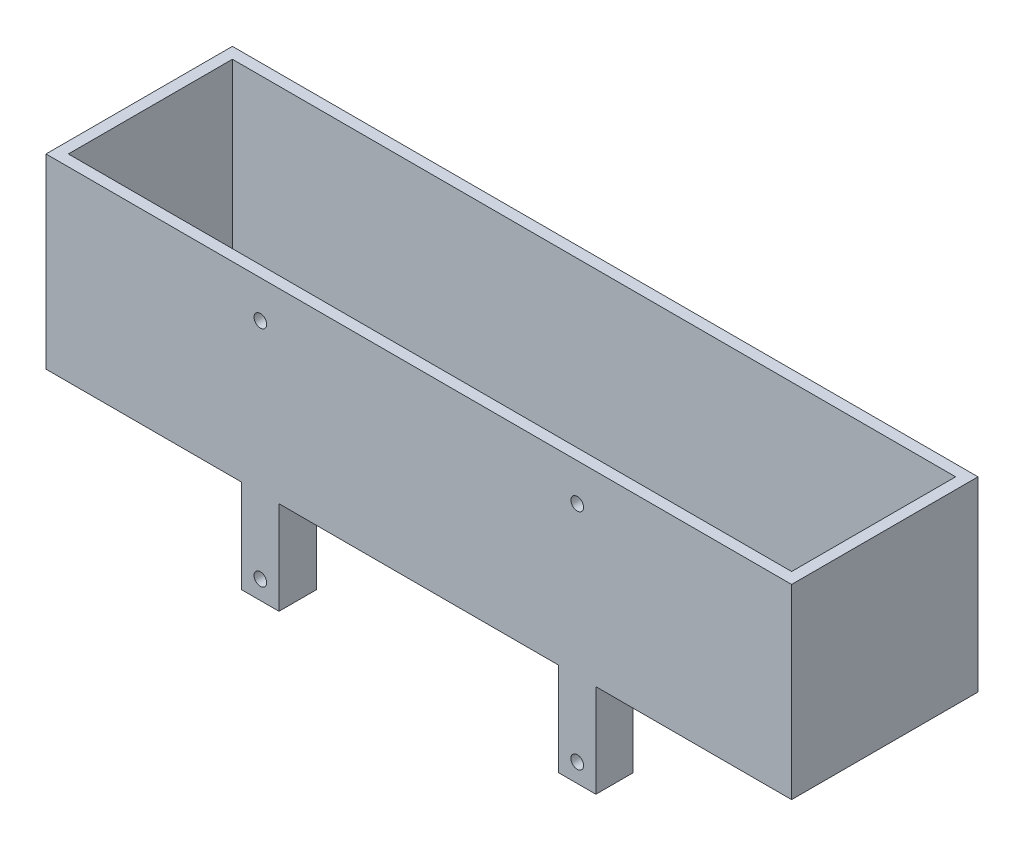
ISO-10303-21;
HEADER;
FILE_DESCRIPTION(('STEP AP214'),'2;1');
FILE_NAME('part.step','',(''),(''),'','','');
FILE_SCHEMA(('AUTOMOTIVE_DESIGN { 1 0 10303 214 1 1 1 1 }'));
ENDSEC;
DATA;
#1=APPLICATION_CONTEXT('core data for automotive mechanical design processes');
#2=APPLICATION_PROTOCOL_DEFINITION('international standard','automotive_design',2000,#1);
#3=PRODUCT_CONTEXT('',#1,'mechanical');
#4=PRODUCT('Part','Part','',(#3));
#5=PRODUCT_RELATED_PRODUCT_CATEGORY('part','',(#4));
#6=PRODUCT_DEFINITION_FORMATION('','',#4);
#7=PRODUCT_DEFINITION_CONTEXT('part definition',#1,'design');
#8=PRODUCT_DEFINITION('design','',#6,#7);
#9=PRODUCT_DEFINITION_SHAPE('','',#8);
#10=(LENGTH_UNIT() NAMED_UNIT(*) SI_UNIT(.MILLI.,.METRE.));
#11=(NAMED_UNIT(*) PLANE_ANGLE_UNIT() SI_UNIT($,.RADIAN.));
#12=(NAMED_UNIT(*) SI_UNIT($,.STERADIAN.) SOLID_ANGLE_UNIT());
#13=UNCERTAINTY_MEASURE_WITH_UNIT(LENGTH_MEASURE(1.E-05),#10,'distance_accuracy_value','');
#14=(GEOMETRIC_REPRESENTATION_CONTEXT(3) GLOBAL_UNCERTAINTY_ASSIGNED_CONTEXT((#13)) GLOBAL_UNIT_ASSIGNED_CONTEXT((#10,
#11,#12)) REPRESENTATION_CONTEXT('',''));
#15=CARTESIAN_POINT('',(0.,0.,0.));
#16=DIRECTION('',(0.,0.,1.));
#17=DIRECTION('',(1.,0.,0.));
#18=AXIS2_PLACEMENT_3D('',#15,#16,#17);
#19=CARTESIAN_POINT('',(-100.,0.,50.));
#20=DIRECTION('',(0.,1.,0.));
#21=DIRECTION('',(0.,0.,1.));
#22=AXIS2_PLACEMENT_3D('',#19,#20,#21);
#23=PLANE('',#22);
#24=CARTESIAN_POINT('',(-70.,0.,35.));
#25=DIRECTION('',(0.,-1.,0.));
#26=DIRECTION('',(0.,0.,-1.));
#27=AXIS2_PLACEMENT_3D('',#24,#25,#26);
#28=CIRCLE('',#27,1.69999999999999);
#29=CARTESIAN_POINT('',(-70.,0.,33.3));
#30=VERTEX_POINT('',#29);
#31=EDGE_CURVE('E439',#30,#30,#28,.T.);
#32=ORIENTED_EDGE('',*,*,#31,.F.);
#33=EDGE_LOOP('',(#32));
#34=FACE_BOUND('',#33,.T.);
#35=CARTESIAN_POINT('',(70.,0.,15.));
#36=DIRECTION('',(0.,-1.,0.));
#37=DIRECTION('',(0.,0.,-1.));
#38=AXIS2_PLACEMENT_3D('',#35,#36,#37);
#39=CIRCLE('',#38,1.69999999999999);
#40=CARTESIAN_POINT('',(70.,0.,13.3));
#41=VERTEX_POINT('',#40);
#42=EDGE_CURVE('E449',#41,#41,#39,.T.);
#43=ORIENTED_EDGE('',*,*,#42,.F.);
#44=EDGE_LOOP('',(#43));
#45=FACE_BOUND('',#44,.T.);
#46=CARTESIAN_POINT('',(70.,0.,35.));
#47=DIRECTION('',(0.,-1.,0.));
#48=DIRECTION('',(0.,0.,-1.));
#49=AXIS2_PLACEMENT_3D('',#46,#47,#48);
#50=CIRCLE('',#49,1.69999999999999);
#51=CARTESIAN_POINT('',(70.,0.,33.3));
#52=VERTEX_POINT('',#51);
#53=EDGE_CURVE('E432',#52,#52,#50,.T.);
#54=ORIENTED_EDGE('',*,*,#53,.F.);
#55=EDGE_LOOP('',(#54));
#56=FACE_BOUND('',#55,.T.);
#57=CARTESIAN_POINT('',(-70.,0.,15.));
#58=DIRECTION('',(0.,-1.,0.));
#59=DIRECTION('',(0.,0.,-1.));
#60=AXIS2_PLACEMENT_3D('',#57,#58,#59);
#61=CIRCLE('',#60,1.69999999999999);
#62=CARTESIAN_POINT('',(-70.,0.,13.3));
#63=VERTEX_POINT('',#62);
#64=EDGE_CURVE('E444',#63,#63,#61,.T.);
#65=ORIENTED_EDGE('',*,*,#64,.F.);
#66=EDGE_LOOP('',(#65));
#67=FACE_BOUND('',#66,.T.);
#68=DIRECTION('',(0.,0.,-1.));
#69=VECTOR('',#68,1.);
#70=CARTESIAN_POINT('',(-47.5,0.,40.));
#71=LINE('',#70,#69);
#72=CARTESIAN_POINT('',(-47.5,0.,50.));
#73=VERTEX_POINT('',#72);
#74=CARTESIAN_POINT('',(-47.5,0.,40.));
#75=VERTEX_POINT('',#74);
#76=EDGE_CURVE('E179',#73,#75,#71,.T.);
#77=ORIENTED_EDGE('',*,*,#76,.F.);
#78=DIRECTION('',(1.,0.,0.));
#79=VECTOR('',#78,1.);
#80=CARTESIAN_POINT('',(-100.,0.,50.));
#81=LINE('',#80,#79);
#82=CARTESIAN_POINT('',(-100.,0.,50.));
#83=VERTEX_POINT('',#82);
#84=EDGE_CURVE('E246',#83,#73,#81,.T.);
#85=ORIENTED_EDGE('',*,*,#84,.F.);
#86=DIRECTION('',(0.,0.,-1.));
#87=VECTOR('',#86,1.);
#88=CARTESIAN_POINT('',(-100.,0.,50.));
#89=LINE('',#88,#87);
#90=CARTESIAN_POINT('',(-100.,0.,0.));
#91=VERTEX_POINT('',#90);
#92=EDGE_CURVE('E11',#83,#91,#89,.T.);
#93=ORIENTED_EDGE('',*,*,#92,.T.);
#94=DIRECTION('',(1.,0.,0.));
#95=VECTOR('',#94,1.);
#96=CARTESIAN_POINT('',(-100.,0.,0.));
#97=LINE('',#96,#95);
#98=CARTESIAN_POINT('',(100.,0.,0.));
#99=VERTEX_POINT('',#98);
#100=EDGE_CURVE('E257',#91,#99,#97,.T.);
#101=ORIENTED_EDGE('',*,*,#100,.T.);
#102=DIRECTION('',(0.,0.,-1.));
#103=VECTOR('',#102,1.);
#104=CARTESIAN_POINT('',(100.,0.,50.));
#105=LINE('',#104,#103);
#106=CARTESIAN_POINT('',(100.,0.,50.));
#107=VERTEX_POINT('',#106);
#108=EDGE_CURVE('E51',#107,#99,#105,.T.);
#109=ORIENTED_EDGE('',*,*,#108,.F.);
#110=CARTESIAN_POINT('',(47.5,0.,50.));
#111=VERTEX_POINT('',#110);
#112=EDGE_CURVE('E249',#111,#107,#81,.T.);
#113=ORIENTED_EDGE('',*,*,#112,.F.);
#114=DIRECTION('',(0.,0.,1.));
#115=VECTOR('',#114,1.);
#116=CARTESIAN_POINT('',(47.5,0.,40.));
#117=LINE('',#116,#115);
#118=CARTESIAN_POINT('',(47.5,0.,40.));
#119=VERTEX_POINT('',#118);
#120=EDGE_CURVE('E200',#119,#111,#117,.T.);
#121=ORIENTED_EDGE('',*,*,#120,.F.);
#122=DIRECTION('',(1.,0.,0.));
#123=VECTOR('',#122,1.);
#124=CARTESIAN_POINT('',(37.5,0.,40.));
#125=LINE('',#124,#123);
#126=CARTESIAN_POINT('',(37.5,0.,40.));
#127=VERTEX_POINT('',#126);
#128=EDGE_CURVE('E63',#127,#119,#125,.T.);
#129=ORIENTED_EDGE('',*,*,#128,.F.);
#130=DIRECTION('',(0.,0.,-1.));
#131=VECTOR('',#130,1.);
#132=CARTESIAN_POINT('',(37.5,0.,40.));
#133=LINE('',#132,#131);
#134=CARTESIAN_POINT('',(37.5,0.,50.));
#135=VERTEX_POINT('',#134);
#136=EDGE_CURVE('E204',#135,#127,#133,.T.);
#137=ORIENTED_EDGE('',*,*,#136,.F.);
#138=CARTESIAN_POINT('',(-37.5,0.,50.));
#139=VERTEX_POINT('',#138);
#140=EDGE_CURVE('E251',#139,#135,#81,.T.);
#141=ORIENTED_EDGE('',*,*,#140,.F.);
#142=DIRECTION('',(0.,0.,1.));
#143=VECTOR('',#142,1.);
#144=CARTESIAN_POINT('',(-37.5,0.,40.));
#145=LINE('',#144,#143);
#146=CARTESIAN_POINT('',(-37.5,0.,40.));
#147=VERTEX_POINT('',#146);
#148=EDGE_CURVE('E171',#147,#139,#145,.T.);
#149=ORIENTED_EDGE('',*,*,#148,.F.);
#150=DIRECTION('',(1.,0.,0.));
#151=VECTOR('',#150,1.);
#152=CARTESIAN_POINT('',(-47.5,0.,40.));
#153=LINE('',#152,#151);
#154=EDGE_CURVE('E59',#75,#147,#153,.T.);
#155=ORIENTED_EDGE('',*,*,#154,.F.);
#156=EDGE_LOOP('',(#77,#85,#93,#101,#109,#113,#121,#129,#137,#141,#149,#155));
#157=FACE_BOUND('',#156,.T.);
#158=ADVANCED_FACE('F43',(#34,#45,#56,#67,#157),#23,.F.);
#159=CARTESIAN_POINT('',(-100.,0.,50.));
#160=DIRECTION('',(1.,0.,0.));
#161=DIRECTION('',(0.,0.,-1.));
#162=AXIS2_PLACEMENT_3D('',#159,#160,#161);
#163=PLANE('',#162);
#164=DIRECTION('',(0.,-1.,0.));
#165=VECTOR('',#164,1.);
#166=CARTESIAN_POINT('',(-100.,0.,0.));
#167=LINE('',#166,#165);
#168=CARTESIAN_POINT('',(-100.,50.,0.));
#169=VERTEX_POINT('',#168);
#170=EDGE_CURVE('E240',#169,#91,#167,.T.);
#171=ORIENTED_EDGE('',*,*,#170,.T.);
#172=ORIENTED_EDGE('',*,*,#92,.F.);
#173=DIRECTION('',(0.,-1.,0.));
#174=VECTOR('',#173,1.);
#175=CARTESIAN_POINT('',(-100.,0.,50.));
#176=LINE('',#175,#174);
#177=CARTESIAN_POINT('',(-100.,50.,50.));
#178=VERTEX_POINT('',#177);
#179=EDGE_CURVE('E241',#178,#83,#176,.T.);
#180=ORIENTED_EDGE('',*,*,#179,.F.);
#181=DIRECTION('',(0.,0.,-1.));
#182=VECTOR('',#181,1.);
#183=CARTESIAN_POINT('',(-100.,50.,50.));
#184=LINE('',#183,#182);
#185=EDGE_CURVE('E260',#178,#169,#184,.T.);
#186=ORIENTED_EDGE('',*,*,#185,.T.);
#187=EDGE_LOOP('',(#171,#172,#180,#186));
#188=FACE_BOUND('',#187,.T.);
#189=ADVANCED_FACE('F44',(#188),#163,.F.);
#190=CARTESIAN_POINT('',(100.,0.,50.));
#191=DIRECTION('',(-1.,0.,0.));
#192=DIRECTION('',(0.,0.,1.));
#193=AXIS2_PLACEMENT_3D('',#190,#191,#192);
#194=PLANE('',#193);
#195=DIRECTION('',(0.,1.,0.));
#196=VECTOR('',#195,1.);
#197=CARTESIAN_POINT('',(100.,0.,0.));
#198=LINE('',#197,#196);
#199=CARTESIAN_POINT('',(100.,50.,0.));
#200=VERTEX_POINT('',#199);
#201=EDGE_CURVE('E265',#99,#200,#198,.T.);
#202=ORIENTED_EDGE('',*,*,#201,.T.);
#203=DIRECTION('',(0.,0.,-1.));
#204=VECTOR('',#203,1.);
#205=CARTESIAN_POINT('',(100.,50.,50.));
#206=LINE('',#205,#204);
#207=CARTESIAN_POINT('',(100.,50.,50.));
#208=VERTEX_POINT('',#207);
#209=EDGE_CURVE('E270',#208,#200,#206,.T.);
#210=ORIENTED_EDGE('',*,*,#209,.F.);
#211=DIRECTION('',(0.,1.,0.));
#212=VECTOR('',#211,1.);
#213=CARTESIAN_POINT('',(100.,0.,50.));
#214=LINE('',#213,#212);
#215=EDGE_CURVE('E252',#107,#208,#214,.T.);
#216=ORIENTED_EDGE('',*,*,#215,.F.);
#217=ORIENTED_EDGE('',*,*,#108,.T.);
#218=EDGE_LOOP('',(#202,#210,#216,#217));
#219=FACE_BOUND('',#218,.T.);
#220=ADVANCED_FACE('F273',(#219),#194,.F.);
#221=CARTESIAN_POINT('',(-100.,50.,50.));
#222=DIRECTION('',(0.,-1.,0.));
#223=DIRECTION('',(0.,0.,-1.));
#224=AXIS2_PLACEMENT_3D('',#221,#222,#223);
#225=PLANE('',#224);
#226=DIRECTION('',(1.,0.,0.));
#227=VECTOR('',#226,1.);
#228=CARTESIAN_POINT('',(-97.,50.,47.));
#229=LINE('',#228,#227);
#230=CARTESIAN_POINT('',(-97.,50.,47.));
#231=VERTEX_POINT('',#230);
#232=CARTESIAN_POINT('',(97.,50.,47.));
#233=VERTEX_POINT('',#232);
#234=EDGE_CURVE('E178',#231,#233,#229,.T.);
#235=ORIENTED_EDGE('',*,*,#234,.F.);
#236=DIRECTION('',(0.,0.,1.));
#237=VECTOR('',#236,1.);
#238=CARTESIAN_POINT('',(-97.,50.,3.));
#239=LINE('',#238,#237);
#240=CARTESIAN_POINT('',(-97.,50.,3.));
#241=VERTEX_POINT('',#240);
#242=EDGE_CURVE('E180',#241,#231,#239,.T.);
#243=ORIENTED_EDGE('',*,*,#242,.F.);
#244=DIRECTION('',(-1.,0.,0.));
#245=VECTOR('',#244,1.);
#246=CARTESIAN_POINT('',(-97.,50.,3.));
#247=LINE('',#246,#245);
#248=CARTESIAN_POINT('',(97.,50.,3.));
#249=VERTEX_POINT('',#248);
#250=EDGE_CURVE('E217',#249,#241,#247,.T.);
#251=ORIENTED_EDGE('',*,*,#250,.F.);
#252=DIRECTION('',(0.,0.,-1.));
#253=VECTOR('',#252,1.);
#254=CARTESIAN_POINT('',(97.,50.,3.));
#255=LINE('',#254,#253);
#256=EDGE_CURVE('E228',#233,#249,#255,.T.);
#257=ORIENTED_EDGE('',*,*,#256,.F.);
#258=EDGE_LOOP('',(#235,#243,#251,#257));
#259=FACE_BOUND('',#258,.T.);
#260=DIRECTION('',(-1.,0.,0.));
#261=VECTOR('',#260,1.);
#262=CARTESIAN_POINT('',(-100.,50.,0.));
#263=LINE('',#262,#261);
#264=EDGE_CURVE('E250',#200,#169,#263,.T.);
#265=ORIENTED_EDGE('',*,*,#264,.T.);
#266=ORIENTED_EDGE('',*,*,#185,.F.);
#267=DIRECTION('',(-1.,0.,0.));
#268=VECTOR('',#267,1.);
#269=CARTESIAN_POINT('',(-100.,50.,50.));
#270=LINE('',#269,#268);
#271=EDGE_CURVE('E254',#208,#178,#270,.T.);
#272=ORIENTED_EDGE('',*,*,#271,.F.);
#273=ORIENTED_EDGE('',*,*,#209,.T.);
#274=EDGE_LOOP('',(#265,#266,#272,#273));
#275=FACE_BOUND('',#274,.T.);
#276=ADVANCED_FACE('F284',(#259,#275),#225,.F.);
#277=CARTESIAN_POINT('',(0.,0.,50.));
#278=DIRECTION('',(0.,0.,-1.));
#279=DIRECTION('',(-1.,0.,0.));
#280=AXIS2_PLACEMENT_3D('',#277,#278,#279);
#281=PLANE('',#280);
#282=CARTESIAN_POINT('',(-42.5,-20.,50.));
#283=DIRECTION('',(0.,0.,1.));
#284=DIRECTION('',(1.,0.,0.));
#285=AXIS2_PLACEMENT_3D('',#282,#283,#284);
#286=CIRCLE('',#285,1.7);
#287=CARTESIAN_POINT('',(-40.8,-20.,50.));
#288=VERTEX_POINT('',#287);
#289=EDGE_CURVE('E414',#288,#288,#286,.T.);
#290=ORIENTED_EDGE('',*,*,#289,.F.);
#291=EDGE_LOOP('',(#290));
#292=FACE_BOUND('',#291,.T.);
#293=CARTESIAN_POINT('',(42.5,-20.,50.));
#294=DIRECTION('',(0.,0.,1.));
#295=DIRECTION('',(1.,0.,0.));
#296=AXIS2_PLACEMENT_3D('',#293,#294,#295);
#297=CIRCLE('',#296,1.7);
#298=CARTESIAN_POINT('',(44.2,-20.,50.));
#299=VERTEX_POINT('',#298);
#300=EDGE_CURVE('E415',#299,#299,#297,.T.);
#301=ORIENTED_EDGE('',*,*,#300,.F.);
#302=EDGE_LOOP('',(#301));
#303=FACE_BOUND('',#302,.T.);
#304=CARTESIAN_POINT('',(-42.5,40.,50.));
#305=DIRECTION('',(0.,0.,1.));
#306=DIRECTION('',(1.,0.,0.));
#307=AXIS2_PLACEMENT_3D('',#304,#305,#306);
#308=CIRCLE('',#307,1.7);
#309=CARTESIAN_POINT('',(-40.8,40.,50.));
#310=VERTEX_POINT('',#309);
#311=EDGE_CURVE('E426',#310,#310,#308,.T.);
#312=ORIENTED_EDGE('',*,*,#311,.F.);
#313=EDGE_LOOP('',(#312));
#314=FACE_BOUND('',#313,.T.);
#315=CARTESIAN_POINT('',(42.5,40.,50.));
#316=DIRECTION('',(0.,0.,1.));
#317=DIRECTION('',(1.,0.,0.));
#318=AXIS2_PLACEMENT_3D('',#315,#316,#317);
#319=CIRCLE('',#318,1.7);
#320=CARTESIAN_POINT('',(44.2,40.,50.));
#321=VERTEX_POINT('',#320);
#322=EDGE_CURVE('E427',#321,#321,#319,.T.);
#323=ORIENTED_EDGE('',*,*,#322,.F.);
#324=EDGE_LOOP('',(#323));
#325=FACE_BOUND('',#324,.T.);
#326=ORIENTED_EDGE('',*,*,#179,.T.);
#327=ORIENTED_EDGE('',*,*,#84,.T.);
#328=DIRECTION('',(0.,1.,0.));
#329=VECTOR('',#328,1.);
#330=CARTESIAN_POINT('',(-47.5,-25.,50.));
#331=LINE('',#330,#329);
#332=CARTESIAN_POINT('',(-47.5,-25.,50.));
#333=VERTEX_POINT('',#332);
#334=EDGE_CURVE('E456',#333,#73,#331,.T.);
#335=ORIENTED_EDGE('',*,*,#334,.F.);
#336=DIRECTION('',(-1.,0.,0.));
#337=VECTOR('',#336,1.);
#338=CARTESIAN_POINT('',(-47.5,-25.,50.));
#339=LINE('',#338,#337);
#340=CARTESIAN_POINT('',(-37.5,-25.,50.));
#341=VERTEX_POINT('',#340);
#342=EDGE_CURVE('E168',#341,#333,#339,.T.);
#343=ORIENTED_EDGE('',*,*,#342,.F.);
#344=DIRECTION('',(0.,1.,0.));
#345=VECTOR('',#344,1.);
#346=CARTESIAN_POINT('',(-37.5,-25.,50.));
#347=LINE('',#346,#345);
#348=EDGE_CURVE('E185',#341,#139,#347,.T.);
#349=ORIENTED_EDGE('',*,*,#348,.T.);
#350=ORIENTED_EDGE('',*,*,#140,.T.);
#351=DIRECTION('',(0.,1.,0.));
#352=VECTOR('',#351,1.);
#353=CARTESIAN_POINT('',(37.5,-25.,50.));
#354=LINE('',#353,#352);
#355=CARTESIAN_POINT('',(37.5,-25.,50.));
#356=VERTEX_POINT('',#355);
#357=EDGE_CURVE('E193',#356,#135,#354,.T.);
#358=ORIENTED_EDGE('',*,*,#357,.F.);
#359=DIRECTION('',(-1.,0.,0.));
#360=VECTOR('',#359,1.);
#361=CARTESIAN_POINT('',(37.5,-25.,50.));
#362=LINE('',#361,#360);
#363=CARTESIAN_POINT('',(47.5,-25.,50.));
#364=VERTEX_POINT('',#363);
#365=EDGE_CURVE('E196',#364,#356,#362,.T.);
#366=ORIENTED_EDGE('',*,*,#365,.F.);
#367=DIRECTION('',(0.,1.,0.));
#368=VECTOR('',#367,1.);
#369=CARTESIAN_POINT('',(47.5,-25.,50.));
#370=LINE('',#369,#368);
#371=EDGE_CURVE('E194',#364,#111,#370,.T.);
#372=ORIENTED_EDGE('',*,*,#371,.T.);
#373=ORIENTED_EDGE('',*,*,#112,.T.);
#374=ORIENTED_EDGE('',*,*,#215,.T.);
#375=ORIENTED_EDGE('',*,*,#271,.T.);
#376=EDGE_LOOP('',(#326,#327,#335,#343,#349,#350,#358,#366,#372,#373,#374,#375));
#377=FACE_BOUND('',#376,.T.);
#378=ADVANCED_FACE('F290',(#292,#303,#314,#325,#377),#281,.F.);
#379=CARTESIAN_POINT('',(0.,0.,0.));
#380=DIRECTION('',(0.,0.,-1.));
#381=DIRECTION('',(-1.,0.,0.));
#382=AXIS2_PLACEMENT_3D('',#379,#380,#381);
#383=PLANE('',#382);
#384=ORIENTED_EDGE('',*,*,#170,.F.);
#385=ORIENTED_EDGE('',*,*,#264,.F.);
#386=ORIENTED_EDGE('',*,*,#201,.F.);
#387=ORIENTED_EDGE('',*,*,#100,.F.);
#388=EDGE_LOOP('',(#384,#385,#386,#387));
#389=FACE_BOUND('',#388,.T.);
#390=ADVANCED_FACE('F276',(#389),#383,.T.);
#391=CARTESIAN_POINT('',(-97.,3.,3.));
#392=DIRECTION('',(-1.,0.,0.));
#393=DIRECTION('',(0.,0.,1.));
#394=AXIS2_PLACEMENT_3D('',#391,#392,#393);
#395=PLANE('',#394);
#396=ORIENTED_EDGE('',*,*,#242,.T.);
#397=DIRECTION('',(0.,1.,0.));
#398=VECTOR('',#397,1.);
#399=CARTESIAN_POINT('',(-97.,3.,47.));
#400=LINE('',#399,#398);
#401=CARTESIAN_POINT('',(-97.,3.,47.));
#402=VERTEX_POINT('',#401);
#403=EDGE_CURVE('E227',#402,#231,#400,.T.);
#404=ORIENTED_EDGE('',*,*,#403,.F.);
#405=DIRECTION('',(0.,0.,1.));
#406=VECTOR('',#405,1.);
#407=CARTESIAN_POINT('',(-97.,3.,3.));
#408=LINE('',#407,#406);
#409=CARTESIAN_POINT('',(-97.,3.,3.));
#410=VERTEX_POINT('',#409);
#411=EDGE_CURVE('E212',#410,#402,#408,.T.);
#412=ORIENTED_EDGE('',*,*,#411,.F.);
#413=DIRECTION('',(0.,1.,0.));
#414=VECTOR('',#413,1.);
#415=CARTESIAN_POINT('',(-97.,3.,3.));
#416=LINE('',#415,#414);
#417=EDGE_CURVE('E233',#410,#241,#416,.T.);
#418=ORIENTED_EDGE('',*,*,#417,.T.);
#419=EDGE_LOOP('',(#396,#404,#412,#418));
#420=FACE_BOUND('',#419,.T.);
#421=ADVANCED_FACE('F340',(#420),#395,.F.);
#422=CARTESIAN_POINT('',(-97.,3.,3.));
#423=DIRECTION('',(0.,0.,-1.));
#424=DIRECTION('',(-1.,0.,0.));
#425=AXIS2_PLACEMENT_3D('',#422,#423,#424);
#426=PLANE('',#425);
#427=ORIENTED_EDGE('',*,*,#250,.T.);
#428=ORIENTED_EDGE('',*,*,#417,.F.);
#429=DIRECTION('',(-1.,0.,0.));
#430=VECTOR('',#429,1.);
#431=CARTESIAN_POINT('',(-97.,3.,3.));
#432=LINE('',#431,#430);
#433=CARTESIAN_POINT('',(97.,3.,3.));
#434=VERTEX_POINT('',#433);
#435=EDGE_CURVE('E221',#434,#410,#432,.T.);
#436=ORIENTED_EDGE('',*,*,#435,.F.);
#437=DIRECTION('',(0.,1.,0.));
#438=VECTOR('',#437,1.);
#439=CARTESIAN_POINT('',(97.,3.,3.));
#440=LINE('',#439,#438);
#441=EDGE_CURVE('E236',#434,#249,#440,.T.);
#442=ORIENTED_EDGE('',*,*,#441,.T.);
#443=EDGE_LOOP('',(#427,#428,#436,#442));
#444=FACE_BOUND('',#443,.T.);
#445=ADVANCED_FACE('F345',(#444),#426,.F.);
#446=CARTESIAN_POINT('',(97.,3.,3.));
#447=DIRECTION('',(1.,0.,0.));
#448=DIRECTION('',(0.,0.,-1.));
#449=AXIS2_PLACEMENT_3D('',#446,#447,#448);
#450=PLANE('',#449);
#451=ORIENTED_EDGE('',*,*,#256,.T.);
#452=ORIENTED_EDGE('',*,*,#441,.F.);
#453=DIRECTION('',(0.,0.,-1.));
#454=VECTOR('',#453,1.);
#455=CARTESIAN_POINT('',(97.,3.,3.));
#456=LINE('',#455,#454);
#457=CARTESIAN_POINT('',(97.,3.,47.));
#458=VERTEX_POINT('',#457);
#459=EDGE_CURVE('E222',#458,#434,#456,.T.);
#460=ORIENTED_EDGE('',*,*,#459,.F.);
#461=DIRECTION('',(0.,1.,0.));
#462=VECTOR('',#461,1.);
#463=CARTESIAN_POINT('',(97.,3.,47.));
#464=LINE('',#463,#462);
#465=EDGE_CURVE('E238',#458,#233,#464,.T.);
#466=ORIENTED_EDGE('',*,*,#465,.T.);
#467=EDGE_LOOP('',(#451,#452,#460,#466));
#468=FACE_BOUND('',#467,.T.);
#469=ADVANCED_FACE('F346',(#468),#450,.F.);
#470=CARTESIAN_POINT('',(-97.,3.,47.));
#471=DIRECTION('',(0.,0.,1.));
#472=DIRECTION('',(1.,0.,0.));
#473=AXIS2_PLACEMENT_3D('',#470,#471,#472);
#474=PLANE('',#473);
#475=CARTESIAN_POINT('',(-42.5,40.,47.));
#476=DIRECTION('',(0.,0.,1.));
#477=DIRECTION('',(1.,0.,0.));
#478=AXIS2_PLACEMENT_3D('',#475,#476,#477);
#479=CIRCLE('',#478,1.7);
#480=CARTESIAN_POINT('',(-40.8,40.,47.));
#481=VERTEX_POINT('',#480);
#482=EDGE_CURVE('E425',#481,#481,#479,.T.);
#483=ORIENTED_EDGE('',*,*,#482,.T.);
#484=EDGE_LOOP('',(#483));
#485=FACE_BOUND('',#484,.T.);
#486=CARTESIAN_POINT('',(42.5,40.,47.));
#487=DIRECTION('',(0.,0.,1.));
#488=DIRECTION('',(1.,0.,0.));
#489=AXIS2_PLACEMENT_3D('',#486,#487,#488);
#490=CIRCLE('',#489,1.7);
#491=CARTESIAN_POINT('',(44.2,40.,47.));
#492=VERTEX_POINT('',#491);
#493=EDGE_CURVE('E413',#492,#492,#490,.T.);
#494=ORIENTED_EDGE('',*,*,#493,.T.);
#495=EDGE_LOOP('',(#494));
#496=FACE_BOUND('',#495,.T.);
#497=ORIENTED_EDGE('',*,*,#234,.T.);
#498=ORIENTED_EDGE('',*,*,#465,.F.);
#499=DIRECTION('',(1.,0.,0.));
#500=VECTOR('',#499,1.);
#501=CARTESIAN_POINT('',(-97.,3.,47.));
#502=LINE('',#501,#500);
#503=EDGE_CURVE('E220',#402,#458,#502,.T.);
#504=ORIENTED_EDGE('',*,*,#503,.F.);
#505=ORIENTED_EDGE('',*,*,#403,.T.);
#506=EDGE_LOOP('',(#497,#498,#504,#505));
#507=FACE_BOUND('',#506,.T.);
#508=ADVANCED_FACE('F343',(#485,#496,#507),#474,.F.);
#509=CARTESIAN_POINT('',(0.,3.,0.));
#510=DIRECTION('',(0.,1.,0.));
#511=DIRECTION('',(0.,0.,1.));
#512=AXIS2_PLACEMENT_3D('',#509,#510,#511);
#513=PLANE('',#512);
#514=CARTESIAN_POINT('',(-70.,3.,35.));
#515=DIRECTION('',(0.,-1.,0.));
#516=DIRECTION('',(0.,0.,-1.));
#517=AXIS2_PLACEMENT_3D('',#514,#515,#516);
#518=CIRCLE('',#517,1.69999999999999);
#519=CARTESIAN_POINT('',(-70.,3.,33.3));
#520=VERTEX_POINT('',#519);
#521=EDGE_CURVE('E441',#520,#520,#518,.T.);
#522=ORIENTED_EDGE('',*,*,#521,.T.);
#523=EDGE_LOOP('',(#522));
#524=FACE_BOUND('',#523,.T.);
#525=CARTESIAN_POINT('',(70.,3.,15.));
#526=DIRECTION('',(0.,-1.,0.));
#527=DIRECTION('',(0.,0.,-1.));
#528=AXIS2_PLACEMENT_3D('',#525,#526,#527);
#529=CIRCLE('',#528,1.69999999999999);
#530=CARTESIAN_POINT('',(70.,3.,13.3));
#531=VERTEX_POINT('',#530);
#532=EDGE_CURVE('E440',#531,#531,#529,.T.);
#533=ORIENTED_EDGE('',*,*,#532,.T.);
#534=EDGE_LOOP('',(#533));
#535=FACE_BOUND('',#534,.T.);
#536=CARTESIAN_POINT('',(70.,3.,35.));
#537=DIRECTION('',(0.,-1.,0.));
#538=DIRECTION('',(0.,0.,-1.));
#539=AXIS2_PLACEMENT_3D('',#536,#537,#538);
#540=CIRCLE('',#539,1.69999999999999);
#541=CARTESIAN_POINT('',(70.,3.,33.3));
#542=VERTEX_POINT('',#541);
#543=EDGE_CURVE('E422',#542,#542,#540,.T.);
#544=ORIENTED_EDGE('',*,*,#543,.T.);
#545=EDGE_LOOP('',(#544));
#546=FACE_BOUND('',#545,.T.);
#547=CARTESIAN_POINT('',(-70.,3.,15.));
#548=DIRECTION('',(0.,-1.,0.));
#549=DIRECTION('',(0.,0.,-1.));
#550=AXIS2_PLACEMENT_3D('',#547,#548,#549);
#551=CIRCLE('',#550,1.69999999999999);
#552=CARTESIAN_POINT('',(-70.,3.,13.3));
#553=VERTEX_POINT('',#552);
#554=EDGE_CURVE('E186',#553,#553,#551,.T.);
#555=ORIENTED_EDGE('',*,*,#554,.T.);
#556=EDGE_LOOP('',(#555));
#557=FACE_BOUND('',#556,.T.);
#558=ORIENTED_EDGE('',*,*,#411,.T.);
#559=ORIENTED_EDGE('',*,*,#503,.T.);
#560=ORIENTED_EDGE('',*,*,#459,.T.);
#561=ORIENTED_EDGE('',*,*,#435,.T.);
#562=EDGE_LOOP('',(#558,#559,#560,#561));
#563=FACE_BOUND('',#562,.T.);
#564=ADVANCED_FACE('F318',(#524,#535,#546,#557,#563),#513,.T.);
#565=CARTESIAN_POINT('',(37.5,-25.,40.));
#566=DIRECTION('',(1.,0.,0.));
#567=DIRECTION('',(0.,0.,-1.));
#568=AXIS2_PLACEMENT_3D('',#565,#566,#567);
#569=PLANE('',#568);
#570=ORIENTED_EDGE('',*,*,#136,.T.);
#571=DIRECTION('',(0.,1.,0.));
#572=VECTOR('',#571,1.);
#573=CARTESIAN_POINT('',(37.5,-25.,40.));
#574=LINE('',#573,#572);
#575=CARTESIAN_POINT('',(37.5,-25.,40.));
#576=VERTEX_POINT('',#575);
#577=EDGE_CURVE('E187',#576,#127,#574,.T.);
#578=ORIENTED_EDGE('',*,*,#577,.F.);
#579=DIRECTION('',(0.,0.,-1.));
#580=VECTOR('',#579,1.);
#581=CARTESIAN_POINT('',(37.5,-25.,40.));
#582=LINE('',#581,#580);
#583=EDGE_CURVE('E205',#356,#576,#582,.T.);
#584=ORIENTED_EDGE('',*,*,#583,.F.);
#585=ORIENTED_EDGE('',*,*,#357,.T.);
#586=EDGE_LOOP('',(#570,#578,#584,#585));
#587=FACE_BOUND('',#586,.T.);
#588=ADVANCED_FACE('F300',(#587),#569,.F.);
#589=CARTESIAN_POINT('',(37.5,-25.,40.));
#590=DIRECTION('',(0.,0.,1.));
#591=DIRECTION('',(1.,0.,0.));
#592=AXIS2_PLACEMENT_3D('',#589,#590,#591);
#593=PLANE('',#592);
#594=CARTESIAN_POINT('',(42.5,-20.,40.));
#595=DIRECTION('',(0.,0.,1.));
#596=DIRECTION('',(1.,0.,0.));
#597=AXIS2_PLACEMENT_3D('',#594,#595,#596);
#598=CIRCLE('',#597,1.7);
#599=CARTESIAN_POINT('',(44.2,-20.,40.));
#600=VERTEX_POINT('',#599);
#601=EDGE_CURVE('E416',#600,#600,#598,.T.);
#602=ORIENTED_EDGE('',*,*,#601,.T.);
#603=EDGE_LOOP('',(#602));
#604=FACE_BOUND('',#603,.T.);
#605=ORIENTED_EDGE('',*,*,#128,.T.);
#606=DIRECTION('',(0.,1.,0.));
#607=VECTOR('',#606,1.);
#608=CARTESIAN_POINT('',(47.5,-25.,40.));
#609=LINE('',#608,#607);
#610=CARTESIAN_POINT('',(47.5,-25.,40.));
#611=VERTEX_POINT('',#610);
#612=EDGE_CURVE('E190',#611,#119,#609,.T.);
#613=ORIENTED_EDGE('',*,*,#612,.F.);
#614=DIRECTION('',(1.,0.,0.));
#615=VECTOR('',#614,1.);
#616=CARTESIAN_POINT('',(37.5,-25.,40.));
#617=LINE('',#616,#615);
#618=EDGE_CURVE('E209',#576,#611,#617,.T.);
#619=ORIENTED_EDGE('',*,*,#618,.F.);
#620=ORIENTED_EDGE('',*,*,#577,.T.);
#621=EDGE_LOOP('',(#605,#613,#619,#620));
#622=FACE_BOUND('',#621,.T.);
#623=ADVANCED_FACE('F307',(#604,#622),#593,.F.);
#624=CARTESIAN_POINT('',(47.5,-25.,40.));
#625=DIRECTION('',(-1.,0.,0.));
#626=DIRECTION('',(0.,0.,1.));
#627=AXIS2_PLACEMENT_3D('',#624,#625,#626);
#628=PLANE('',#627);
#629=ORIENTED_EDGE('',*,*,#120,.T.);
#630=ORIENTED_EDGE('',*,*,#371,.F.);
#631=DIRECTION('',(0.,0.,1.));
#632=VECTOR('',#631,1.);
#633=CARTESIAN_POINT('',(47.5,-25.,40.));
#634=LINE('',#633,#632);
#635=EDGE_CURVE('E208',#611,#364,#634,.T.);
#636=ORIENTED_EDGE('',*,*,#635,.F.);
#637=ORIENTED_EDGE('',*,*,#612,.T.);
#638=EDGE_LOOP('',(#629,#630,#636,#637));
#639=FACE_BOUND('',#638,.T.);
#640=ADVANCED_FACE('F303',(#639),#628,.F.);
#641=CARTESIAN_POINT('',(0.,-25.,0.));
#642=DIRECTION('',(0.,1.,0.));
#643=DIRECTION('',(0.,0.,1.));
#644=AXIS2_PLACEMENT_3D('',#641,#642,#643);
#645=PLANE('',#644);
#646=ORIENTED_EDGE('',*,*,#583,.T.);
#647=ORIENTED_EDGE('',*,*,#618,.T.);
#648=ORIENTED_EDGE('',*,*,#635,.T.);
#649=ORIENTED_EDGE('',*,*,#365,.T.);
#650=EDGE_LOOP('',(#646,#647,#648,#649));
#651=FACE_BOUND('',#650,.T.);
#652=ADVANCED_FACE('F302',(#651),#645,.F.);
#653=CARTESIAN_POINT('',(-47.5,-25.,40.));
#654=DIRECTION('',(1.,0.,0.));
#655=DIRECTION('',(0.,0.,-1.));
#656=AXIS2_PLACEMENT_3D('',#653,#654,#655);
#657=PLANE('',#656);
#658=ORIENTED_EDGE('',*,*,#76,.T.);
#659=DIRECTION('',(0.,1.,0.));
#660=VECTOR('',#659,1.);
#661=CARTESIAN_POINT('',(-47.5,-25.,40.));
#662=LINE('',#661,#660);
#663=CARTESIAN_POINT('',(-47.5,-25.,40.));
#664=VERTEX_POINT('',#663);
#665=EDGE_CURVE('E158',#664,#75,#662,.T.);
#666=ORIENTED_EDGE('',*,*,#665,.F.);
#667=DIRECTION('',(0.,0.,-1.));
#668=VECTOR('',#667,1.);
#669=CARTESIAN_POINT('',(-47.5,-25.,40.));
#670=LINE('',#669,#668);
#671=EDGE_CURVE('E164',#333,#664,#670,.T.);
#672=ORIENTED_EDGE('',*,*,#671,.F.);
#673=ORIENTED_EDGE('',*,*,#334,.T.);
#674=EDGE_LOOP('',(#658,#666,#672,#673));
#675=FACE_BOUND('',#674,.T.);
#676=ADVANCED_FACE('F177',(#675),#657,.F.);
#677=CARTESIAN_POINT('',(-47.5,-25.,40.));
#678=DIRECTION('',(0.,0.,1.));
#679=DIRECTION('',(1.,0.,0.));
#680=AXIS2_PLACEMENT_3D('',#677,#678,#679);
#681=PLANE('',#680);
#682=CARTESIAN_POINT('',(-42.5,-20.,40.));
#683=DIRECTION('',(0.,0.,1.));
#684=DIRECTION('',(1.,0.,0.));
#685=AXIS2_PLACEMENT_3D('',#682,#683,#684);
#686=CIRCLE('',#685,1.7);
#687=CARTESIAN_POINT('',(-40.8,-20.,40.));
#688=VERTEX_POINT('',#687);
#689=EDGE_CURVE('E406',#688,#688,#686,.T.);
#690=ORIENTED_EDGE('',*,*,#689,.T.);
#691=EDGE_LOOP('',(#690));
#692=FACE_BOUND('',#691,.T.);
#693=ORIENTED_EDGE('',*,*,#154,.T.);
#694=DIRECTION('',(0.,1.,0.));
#695=VECTOR('',#694,1.);
#696=CARTESIAN_POINT('',(-37.5,-25.,40.));
#697=LINE('',#696,#695);
#698=CARTESIAN_POINT('',(-37.5,-25.,40.));
#699=VERTEX_POINT('',#698);
#700=EDGE_CURVE('E161',#699,#147,#697,.T.);
#701=ORIENTED_EDGE('',*,*,#700,.F.);
#702=DIRECTION('',(1.,0.,0.));
#703=VECTOR('',#702,1.);
#704=CARTESIAN_POINT('',(-47.5,-25.,40.));
#705=LINE('',#704,#703);
#706=EDGE_CURVE('E152',#664,#699,#705,.T.);
#707=ORIENTED_EDGE('',*,*,#706,.F.);
#708=ORIENTED_EDGE('',*,*,#665,.T.);
#709=EDGE_LOOP('',(#693,#701,#707,#708));
#710=FACE_BOUND('',#709,.T.);
#711=ADVANCED_FACE('F156',(#692,#710),#681,.F.);
#712=CARTESIAN_POINT('',(-37.5,-25.,40.));
#713=DIRECTION('',(-1.,0.,0.));
#714=DIRECTION('',(0.,0.,1.));
#715=AXIS2_PLACEMENT_3D('',#712,#713,#714);
#716=PLANE('',#715);
#717=ORIENTED_EDGE('',*,*,#148,.T.);
#718=ORIENTED_EDGE('',*,*,#348,.F.);
#719=DIRECTION('',(0.,0.,1.));
#720=VECTOR('',#719,1.);
#721=CARTESIAN_POINT('',(-37.5,-25.,40.));
#722=LINE('',#721,#720);
#723=EDGE_CURVE('E163',#699,#341,#722,.T.);
#724=ORIENTED_EDGE('',*,*,#723,.F.);
#725=ORIENTED_EDGE('',*,*,#700,.T.);
#726=EDGE_LOOP('',(#717,#718,#724,#725));
#727=FACE_BOUND('',#726,.T.);
#728=ADVANCED_FACE('F368',(#727),#716,.F.);
#729=CARTESIAN_POINT('',(0.,-25.,0.));
#730=DIRECTION('',(0.,1.,0.));
#731=DIRECTION('',(0.,0.,1.));
#732=AXIS2_PLACEMENT_3D('',#729,#730,#731);
#733=PLANE('',#732);
#734=ORIENTED_EDGE('',*,*,#671,.T.);
#735=ORIENTED_EDGE('',*,*,#706,.T.);
#736=ORIENTED_EDGE('',*,*,#723,.T.);
#737=ORIENTED_EDGE('',*,*,#342,.T.);
#738=EDGE_LOOP('',(#734,#735,#736,#737));
#739=FACE_BOUND('',#738,.T.);
#740=ADVANCED_FACE('F169',(#739),#733,.F.);
#741=CARTESIAN_POINT('',(-70.,3.,15.));
#742=DIRECTION('',(0.,-1.,0.));
#743=DIRECTION('',(0.,0.,-1.));
#744=AXIS2_PLACEMENT_3D('',#741,#742,#743);
#745=CYLINDRICAL_SURFACE('',#744,1.69999999999999);
#746=ORIENTED_EDGE('',*,*,#554,.F.);
#747=EDGE_LOOP('',(#746));
#748=FACE_BOUND('',#747,.T.);
#749=ORIENTED_EDGE('',*,*,#64,.T.);
#750=EDGE_LOOP('',(#749));
#751=FACE_BOUND('',#750,.T.);
#752=ADVANCED_FACE('F373',(#748,#751),#745,.F.);
#753=CARTESIAN_POINT('',(70.,3.,35.));
#754=DIRECTION('',(0.,-1.,0.));
#755=DIRECTION('',(0.,0.,-1.));
#756=AXIS2_PLACEMENT_3D('',#753,#754,#755);
#757=CYLINDRICAL_SURFACE('',#756,1.69999999999999);
#758=ORIENTED_EDGE('',*,*,#543,.F.);
#759=EDGE_LOOP('',(#758));
#760=FACE_BOUND('',#759,.T.);
#761=ORIENTED_EDGE('',*,*,#53,.T.);
#762=EDGE_LOOP('',(#761));
#763=FACE_BOUND('',#762,.T.);
#764=ADVANCED_FACE('F376',(#760,#763),#757,.F.);
#765=CARTESIAN_POINT('',(70.,3.,15.));
#766=DIRECTION('',(0.,-1.,0.));
#767=DIRECTION('',(0.,0.,-1.));
#768=AXIS2_PLACEMENT_3D('',#765,#766,#767);
#769=CYLINDRICAL_SURFACE('',#768,1.69999999999999);
#770=ORIENTED_EDGE('',*,*,#532,.F.);
#771=EDGE_LOOP('',(#770));
#772=FACE_BOUND('',#771,.T.);
#773=ORIENTED_EDGE('',*,*,#42,.T.);
#774=EDGE_LOOP('',(#773));
#775=FACE_BOUND('',#774,.T.);
#776=ADVANCED_FACE('F378',(#772,#775),#769,.F.);
#777=CARTESIAN_POINT('',(-70.,3.,35.));
#778=DIRECTION('',(0.,-1.,0.));
#779=DIRECTION('',(0.,0.,-1.));
#780=AXIS2_PLACEMENT_3D('',#777,#778,#779);
#781=CYLINDRICAL_SURFACE('',#780,1.69999999999999);
#782=ORIENTED_EDGE('',*,*,#521,.F.);
#783=EDGE_LOOP('',(#782));
#784=FACE_BOUND('',#783,.T.);
#785=ORIENTED_EDGE('',*,*,#31,.T.);
#786=EDGE_LOOP('',(#785));
#787=FACE_BOUND('',#786,.T.);
#788=ADVANCED_FACE('F381',(#784,#787),#781,.F.);
#789=CARTESIAN_POINT('',(42.5,40.,47.));
#790=DIRECTION('',(0.,0.,1.));
#791=DIRECTION('',(1.,0.,0.));
#792=AXIS2_PLACEMENT_3D('',#789,#790,#791);
#793=CYLINDRICAL_SURFACE('',#792,1.7);
#794=ORIENTED_EDGE('',*,*,#493,.F.);
#795=EDGE_LOOP('',(#794));
#796=FACE_BOUND('',#795,.T.);
#797=ORIENTED_EDGE('',*,*,#322,.T.);
#798=EDGE_LOOP('',(#797));
#799=FACE_BOUND('',#798,.T.);
#800=ADVANCED_FACE('F384',(#796,#799),#793,.F.);
#801=CARTESIAN_POINT('',(-42.5,40.,47.));
#802=DIRECTION('',(0.,0.,1.));
#803=DIRECTION('',(1.,0.,0.));
#804=AXIS2_PLACEMENT_3D('',#801,#802,#803);
#805=CYLINDRICAL_SURFACE('',#804,1.7);
#806=ORIENTED_EDGE('',*,*,#482,.F.);
#807=EDGE_LOOP('',(#806));
#808=FACE_BOUND('',#807,.T.);
#809=ORIENTED_EDGE('',*,*,#311,.T.);
#810=EDGE_LOOP('',(#809));
#811=FACE_BOUND('',#810,.T.);
#812=ADVANCED_FACE('F394',(#808,#811),#805,.F.);
#813=CARTESIAN_POINT('',(-42.5,-20.,40.));
#814=DIRECTION('',(0.,0.,1.));
#815=DIRECTION('',(1.,0.,0.));
#816=AXIS2_PLACEMENT_3D('',#813,#814,#815);
#817=CYLINDRICAL_SURFACE('',#816,1.7);
#818=ORIENTED_EDGE('',*,*,#689,.F.);
#819=EDGE_LOOP('',(#818));
#820=FACE_BOUND('',#819,.T.);
#821=ORIENTED_EDGE('',*,*,#289,.T.);
#822=EDGE_LOOP('',(#821));
#823=FACE_BOUND('',#822,.T.);
#824=ADVANCED_FACE('F397',(#820,#823),#817,.F.);
#825=CARTESIAN_POINT('',(42.5,-20.,40.));
#826=DIRECTION('',(0.,0.,1.));
#827=DIRECTION('',(1.,0.,0.));
#828=AXIS2_PLACEMENT_3D('',#825,#826,#827);
#829=CYLINDRICAL_SURFACE('',#828,1.7);
#830=ORIENTED_EDGE('',*,*,#601,.F.);
#831=EDGE_LOOP('',(#830));
#832=FACE_BOUND('',#831,.T.);
#833=ORIENTED_EDGE('',*,*,#300,.T.);
#834=EDGE_LOOP('',(#833));
#835=FACE_BOUND('',#834,.T.);
#836=ADVANCED_FACE('F400',(#832,#835),#829,.F.);
#837=CLOSED_SHELL('',(#158,#189,#220,#276,#378,#390,#421,#445,#469,#508,#564,#588,#623,#640,
#652,#676,#711,#728,#740,#752,#764,#776,#788,#800,#812,#824,#836));
#838=MANIFOLD_SOLID_BREP('B2',#837);
#839=ADVANCED_BREP_SHAPE_REPRESENTATION('',(#18,#838),#14);
#840=SHAPE_DEFINITION_REPRESENTATION(#9,#839);
ENDSEC;
END-ISO-10303-21;
